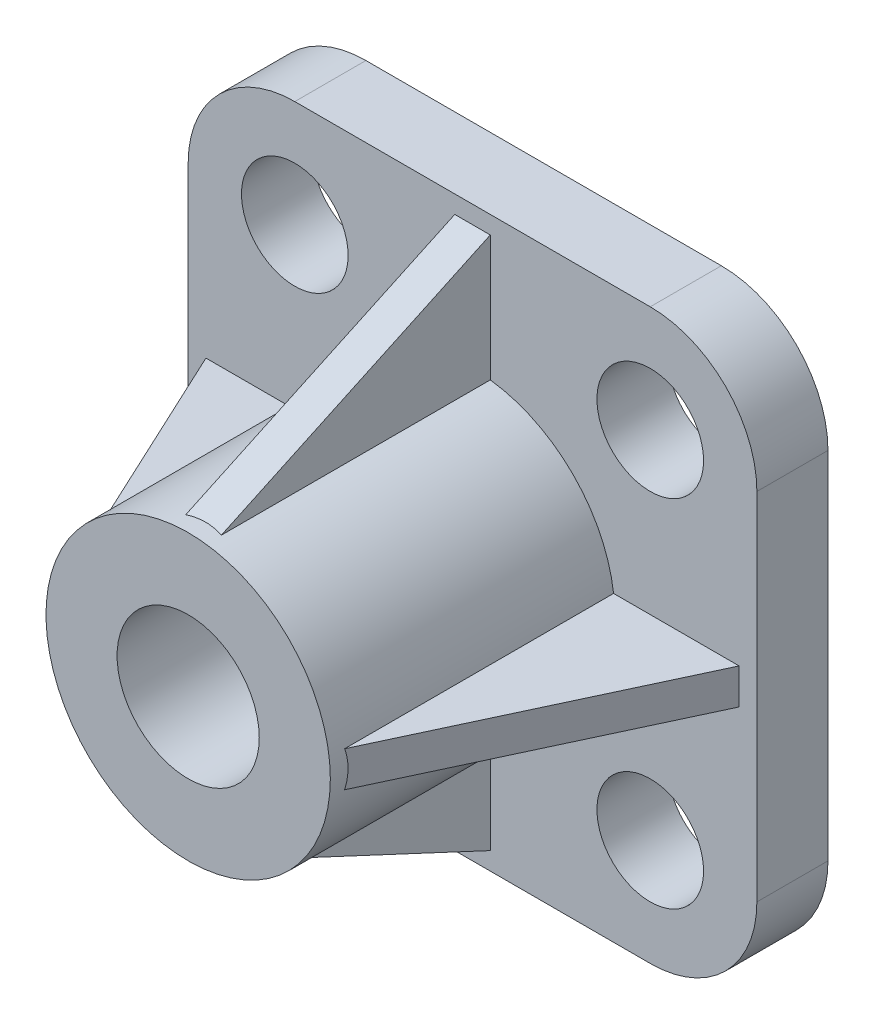
ISO-10303-21;
HEADER;
FILE_DESCRIPTION(('STEP AP214'),'2;1');
FILE_NAME('part.step','',(''),(''),'','','');
FILE_SCHEMA(('AUTOMOTIVE_DESIGN { 1 0 10303 214 1 1 1 1 }'));
ENDSEC;
DATA;
#1=APPLICATION_CONTEXT('core data for automotive mechanical design processes');
#2=APPLICATION_PROTOCOL_DEFINITION('international standard','automotive_design',2000,#1);
#3=PRODUCT_CONTEXT('',#1,'mechanical');
#4=PRODUCT('Part','Part','',(#3));
#5=PRODUCT_RELATED_PRODUCT_CATEGORY('part','',(#4));
#6=PRODUCT_DEFINITION_FORMATION('','',#4);
#7=PRODUCT_DEFINITION_CONTEXT('part definition',#1,'design');
#8=PRODUCT_DEFINITION('design','',#6,#7);
#9=PRODUCT_DEFINITION_SHAPE('','',#8);
#10=(LENGTH_UNIT() NAMED_UNIT(*) SI_UNIT(.MILLI.,.METRE.));
#11=(NAMED_UNIT(*) PLANE_ANGLE_UNIT() SI_UNIT($,.RADIAN.));
#12=(NAMED_UNIT(*) SI_UNIT($,.STERADIAN.) SOLID_ANGLE_UNIT());
#13=UNCERTAINTY_MEASURE_WITH_UNIT(LENGTH_MEASURE(1.E-05),#10,'distance_accuracy_value','');
#14=(GEOMETRIC_REPRESENTATION_CONTEXT(3) GLOBAL_UNCERTAINTY_ASSIGNED_CONTEXT((#13)) GLOBAL_UNIT_ASSIGNED_CONTEXT((#10,
#11,#12)) REPRESENTATION_CONTEXT('',''));
#15=CARTESIAN_POINT('',(0.,0.,0.));
#16=DIRECTION('',(0.,0.,1.));
#17=DIRECTION('',(1.,0.,0.));
#18=AXIS2_PLACEMENT_3D('',#15,#16,#17);
#19=CARTESIAN_POINT('',(0.,80.,-20.));
#20=DIRECTION('',(0.,-1.,0.));
#21=DIRECTION('',(0.,0.,-1.));
#22=AXIS2_PLACEMENT_3D('',#19,#20,#21);
#23=PLANE('',#22);
#24=DIRECTION('',(0.,0.,1.));
#25=VECTOR('',#24,1.);
#26=CARTESIAN_POINT('',(50.,80.,-20.));
#27=LINE('',#26,#25);
#28=CARTESIAN_POINT('',(50.,80.,-20.));
#29=VERTEX_POINT('',#28);
#30=CARTESIAN_POINT('',(50.,80.,0.));
#31=VERTEX_POINT('',#30);
#32=EDGE_CURVE('E343',#29,#31,#27,.T.);
#33=ORIENTED_EDGE('',*,*,#32,.F.);
#34=DIRECTION('',(1.,0.,0.));
#35=VECTOR('',#34,1.);
#36=CARTESIAN_POINT('',(0.,80.,-20.));
#37=LINE('',#36,#35);
#38=CARTESIAN_POINT('',(-50.,80.,-20.));
#39=VERTEX_POINT('',#38);
#40=EDGE_CURVE('E286',#39,#29,#37,.T.);
#41=ORIENTED_EDGE('',*,*,#40,.F.);
#42=DIRECTION('',(0.,0.,1.));
#43=VECTOR('',#42,1.);
#44=CARTESIAN_POINT('',(-50.,80.,-20.));
#45=LINE('',#44,#43);
#46=CARTESIAN_POINT('',(-50.,80.,0.));
#47=VERTEX_POINT('',#46);
#48=EDGE_CURVE('E50',#39,#47,#45,.T.);
#49=ORIENTED_EDGE('',*,*,#48,.T.);
#50=DIRECTION('',(1.,0.,0.));
#51=VECTOR('',#50,1.);
#52=CARTESIAN_POINT('',(0.,80.,0.));
#53=LINE('',#52,#51);
#54=EDGE_CURVE('E322',#47,#31,#53,.T.);
#55=ORIENTED_EDGE('',*,*,#54,.T.);
#56=EDGE_LOOP('',(#33,#41,#49,#55));
#57=FACE_BOUND('',#56,.T.);
#58=ADVANCED_FACE('F43',(#57),#23,.F.);
#59=CARTESIAN_POINT('',(50.,50.,-20.));
#60=DIRECTION('',(0.,0.,1.));
#61=DIRECTION('',(1.,0.,0.));
#62=AXIS2_PLACEMENT_3D('',#59,#60,#61);
#63=CYLINDRICAL_SURFACE('',#62,30.);
#64=CARTESIAN_POINT('',(50.,50.,0.));
#65=DIRECTION('',(0.,0.,1.));
#66=DIRECTION('',(1.,0.,0.));
#67=AXIS2_PLACEMENT_3D('',#64,#65,#66);
#68=CIRCLE('',#67,30.);
#69=CARTESIAN_POINT('',(80.,50.,0.));
#70=VERTEX_POINT('',#69);
#71=EDGE_CURVE('E281',#70,#31,#68,.T.);
#72=ORIENTED_EDGE('',*,*,#71,.F.);
#73=DIRECTION('',(0.,0.,1.));
#74=VECTOR('',#73,1.);
#75=CARTESIAN_POINT('',(80.,50.,-20.));
#76=LINE('',#75,#74);
#77=CARTESIAN_POINT('',(80.,50.,-20.));
#78=VERTEX_POINT('',#77);
#79=EDGE_CURVE('E347',#78,#70,#76,.T.);
#80=ORIENTED_EDGE('',*,*,#79,.F.);
#81=CARTESIAN_POINT('',(50.,50.,-20.));
#82=DIRECTION('',(0.,0.,1.));
#83=DIRECTION('',(1.,0.,0.));
#84=AXIS2_PLACEMENT_3D('',#81,#82,#83);
#85=CIRCLE('',#84,30.);
#86=EDGE_CURVE('E307',#78,#29,#85,.T.);
#87=ORIENTED_EDGE('',*,*,#86,.T.);
#88=ORIENTED_EDGE('',*,*,#32,.T.);
#89=EDGE_LOOP('',(#72,#80,#87,#88));
#90=FACE_BOUND('',#89,.T.);
#91=ADVANCED_FACE('F389',(#90),#63,.T.);
#92=CARTESIAN_POINT('',(80.,0.,-20.));
#93=DIRECTION('',(-1.,0.,0.));
#94=DIRECTION('',(0.,-1.,0.));
#95=AXIS2_PLACEMENT_3D('',#92,#93,#94);
#96=PLANE('',#95);
#97=DIRECTION('',(0.,0.,1.));
#98=VECTOR('',#97,1.);
#99=CARTESIAN_POINT('',(80.,-50.,-20.));
#100=LINE('',#99,#98);
#101=CARTESIAN_POINT('',(80.,-50.,-20.));
#102=VERTEX_POINT('',#101);
#103=CARTESIAN_POINT('',(80.,-50.,0.));
#104=VERTEX_POINT('',#103);
#105=EDGE_CURVE('E346',#102,#104,#100,.T.);
#106=ORIENTED_EDGE('',*,*,#105,.F.);
#107=DIRECTION('',(0.,-1.,0.));
#108=VECTOR('',#107,1.);
#109=CARTESIAN_POINT('',(80.,0.,-20.));
#110=LINE('',#109,#108);
#111=EDGE_CURVE('E301',#78,#102,#110,.T.);
#112=ORIENTED_EDGE('',*,*,#111,.F.);
#113=ORIENTED_EDGE('',*,*,#79,.T.);
#114=DIRECTION('',(0.,-1.,0.));
#115=VECTOR('',#114,1.);
#116=CARTESIAN_POINT('',(80.,0.,0.));
#117=LINE('',#116,#115);
#118=EDGE_CURVE('E338',#70,#104,#117,.T.);
#119=ORIENTED_EDGE('',*,*,#118,.T.);
#120=EDGE_LOOP('',(#106,#112,#113,#119));
#121=FACE_BOUND('',#120,.T.);
#122=ADVANCED_FACE('F393',(#121),#96,.F.);
#123=CARTESIAN_POINT('',(50.,-50.,-20.));
#124=DIRECTION('',(0.,0.,1.));
#125=DIRECTION('',(1.,0.,0.));
#126=AXIS2_PLACEMENT_3D('',#123,#124,#125);
#127=CYLINDRICAL_SURFACE('',#126,30.);
#128=CARTESIAN_POINT('',(50.,-50.,0.));
#129=DIRECTION('',(0.,0.,1.));
#130=DIRECTION('',(1.,0.,0.));
#131=AXIS2_PLACEMENT_3D('',#128,#129,#130);
#132=CIRCLE('',#131,30.);
#133=CARTESIAN_POINT('',(50.,-80.,0.));
#134=VERTEX_POINT('',#133);
#135=EDGE_CURVE('E336',#104,#134,#132,.F.);
#136=ORIENTED_EDGE('',*,*,#135,.T.);
#137=DIRECTION('',(0.,0.,1.));
#138=VECTOR('',#137,1.);
#139=CARTESIAN_POINT('',(50.,-80.,-20.));
#140=LINE('',#139,#138);
#141=CARTESIAN_POINT('',(50.,-80.,-20.));
#142=VERTEX_POINT('',#141);
#143=EDGE_CURVE('E351',#142,#134,#140,.T.);
#144=ORIENTED_EDGE('',*,*,#143,.F.);
#145=CARTESIAN_POINT('',(50.,-50.,-20.));
#146=DIRECTION('',(0.,0.,1.));
#147=DIRECTION('',(1.,0.,0.));
#148=AXIS2_PLACEMENT_3D('',#145,#146,#147);
#149=CIRCLE('',#148,30.);
#150=EDGE_CURVE('E305',#102,#142,#149,.F.);
#151=ORIENTED_EDGE('',*,*,#150,.F.);
#152=ORIENTED_EDGE('',*,*,#105,.T.);
#153=EDGE_LOOP('',(#136,#144,#151,#152));
#154=FACE_BOUND('',#153,.T.);
#155=ADVANCED_FACE('F434',(#154),#127,.T.);
#156=CARTESIAN_POINT('',(0.,-80.,-20.));
#157=DIRECTION('',(0.,-1.,0.));
#158=DIRECTION('',(1.,0.,0.));
#159=AXIS2_PLACEMENT_3D('',#156,#157,#158);
#160=PLANE('',#159);
#161=DIRECTION('',(1.,0.,0.));
#162=VECTOR('',#161,1.);
#163=CARTESIAN_POINT('',(0.,-80.,-20.));
#164=LINE('',#163,#162);
#165=CARTESIAN_POINT('',(-50.,-80.,-20.));
#166=VERTEX_POINT('',#165);
#167=EDGE_CURVE('E300',#166,#142,#164,.T.);
#168=ORIENTED_EDGE('',*,*,#167,.T.);
#169=ORIENTED_EDGE('',*,*,#143,.T.);
#170=DIRECTION('',(1.,0.,0.));
#171=VECTOR('',#170,1.);
#172=CARTESIAN_POINT('',(0.,-80.,0.));
#173=LINE('',#172,#171);
#174=CARTESIAN_POINT('',(-50.,-80.,0.));
#175=VERTEX_POINT('',#174);
#176=EDGE_CURVE('E331',#175,#134,#173,.T.);
#177=ORIENTED_EDGE('',*,*,#176,.F.);
#178=DIRECTION('',(0.,0.,1.));
#179=VECTOR('',#178,1.);
#180=CARTESIAN_POINT('',(-50.,-80.,-20.));
#181=LINE('',#180,#179);
#182=EDGE_CURVE('E353',#166,#175,#181,.T.);
#183=ORIENTED_EDGE('',*,*,#182,.F.);
#184=EDGE_LOOP('',(#168,#169,#177,#183));
#185=FACE_BOUND('',#184,.T.);
#186=ADVANCED_FACE('F438',(#185),#160,.T.);
#187=CARTESIAN_POINT('',(-50.,-50.,-20.));
#188=DIRECTION('',(0.,0.,1.));
#189=DIRECTION('',(1.,0.,0.));
#190=AXIS2_PLACEMENT_3D('',#187,#188,#189);
#191=CYLINDRICAL_SURFACE('',#190,30.);
#192=CARTESIAN_POINT('',(-50.,-50.,0.));
#193=DIRECTION('',(0.,0.,1.));
#194=DIRECTION('',(1.,0.,0.));
#195=AXIS2_PLACEMENT_3D('',#192,#193,#194);
#196=CIRCLE('',#195,30.);
#197=CARTESIAN_POINT('',(-80.,-50.,0.));
#198=VERTEX_POINT('',#197);
#199=EDGE_CURVE('E332',#175,#198,#196,.F.);
#200=ORIENTED_EDGE('',*,*,#199,.T.);
#201=DIRECTION('',(0.,0.,1.));
#202=VECTOR('',#201,1.);
#203=CARTESIAN_POINT('',(-80.,-50.,-20.));
#204=LINE('',#203,#202);
#205=CARTESIAN_POINT('',(-80.,-50.,-20.));
#206=VERTEX_POINT('',#205);
#207=EDGE_CURVE('E357',#206,#198,#204,.T.);
#208=ORIENTED_EDGE('',*,*,#207,.F.);
#209=CARTESIAN_POINT('',(-50.,-50.,-20.));
#210=DIRECTION('',(0.,0.,1.));
#211=DIRECTION('',(1.,0.,0.));
#212=AXIS2_PLACEMENT_3D('',#209,#210,#211);
#213=CIRCLE('',#212,30.);
#214=EDGE_CURVE('E297',#166,#206,#213,.F.);
#215=ORIENTED_EDGE('',*,*,#214,.F.);
#216=ORIENTED_EDGE('',*,*,#182,.T.);
#217=EDGE_LOOP('',(#200,#208,#215,#216));
#218=FACE_BOUND('',#217,.T.);
#219=ADVANCED_FACE('F382',(#218),#191,.T.);
#220=CARTESIAN_POINT('',(-80.,0.,-20.));
#221=DIRECTION('',(-1.,0.,0.));
#222=DIRECTION('',(0.,0.,1.));
#223=AXIS2_PLACEMENT_3D('',#220,#221,#222);
#224=PLANE('',#223);
#225=DIRECTION('',(0.,-1.,0.));
#226=VECTOR('',#225,1.);
#227=CARTESIAN_POINT('',(-80.,0.,-20.));
#228=LINE('',#227,#226);
#229=CARTESIAN_POINT('',(-80.,50.,-20.));
#230=VERTEX_POINT('',#229);
#231=EDGE_CURVE('E293',#230,#206,#228,.T.);
#232=ORIENTED_EDGE('',*,*,#231,.T.);
#233=ORIENTED_EDGE('',*,*,#207,.T.);
#234=DIRECTION('',(0.,-1.,0.));
#235=VECTOR('',#234,1.);
#236=CARTESIAN_POINT('',(-80.,0.,0.));
#237=LINE('',#236,#235);
#238=CARTESIAN_POINT('',(-80.,50.,0.));
#239=VERTEX_POINT('',#238);
#240=EDGE_CURVE('E328',#239,#198,#237,.T.);
#241=ORIENTED_EDGE('',*,*,#240,.F.);
#242=DIRECTION('',(0.,0.,1.));
#243=VECTOR('',#242,1.);
#244=CARTESIAN_POINT('',(-80.,50.,-20.));
#245=LINE('',#244,#243);
#246=EDGE_CURVE('E358',#230,#239,#245,.T.);
#247=ORIENTED_EDGE('',*,*,#246,.F.);
#248=EDGE_LOOP('',(#232,#233,#241,#247));
#249=FACE_BOUND('',#248,.T.);
#250=ADVANCED_FACE('F373',(#249),#224,.T.);
#251=CARTESIAN_POINT('',(-50.,50.,-20.));
#252=DIRECTION('',(0.,0.,1.));
#253=DIRECTION('',(1.,0.,0.));
#254=AXIS2_PLACEMENT_3D('',#251,#252,#253);
#255=CYLINDRICAL_SURFACE('',#254,30.);
#256=CARTESIAN_POINT('',(-50.,50.,0.));
#257=DIRECTION('',(0.,0.,1.));
#258=DIRECTION('',(1.,0.,0.));
#259=AXIS2_PLACEMENT_3D('',#256,#257,#258);
#260=CIRCLE('',#259,30.);
#261=EDGE_CURVE('E326',#47,#239,#260,.T.);
#262=ORIENTED_EDGE('',*,*,#261,.F.);
#263=ORIENTED_EDGE('',*,*,#48,.F.);
#264=CARTESIAN_POINT('',(-50.,50.,-20.));
#265=DIRECTION('',(0.,0.,1.));
#266=DIRECTION('',(1.,0.,0.));
#267=AXIS2_PLACEMENT_3D('',#264,#265,#266);
#268=CIRCLE('',#267,30.);
#269=EDGE_CURVE('E295',#39,#230,#268,.T.);
#270=ORIENTED_EDGE('',*,*,#269,.T.);
#271=ORIENTED_EDGE('',*,*,#246,.T.);
#272=EDGE_LOOP('',(#262,#263,#270,#271));
#273=FACE_BOUND('',#272,.T.);
#274=ADVANCED_FACE('F367',(#273),#255,.T.);
#275=CARTESIAN_POINT('',(50.,-50.,-20.));
#276=DIRECTION('',(0.,0.,1.));
#277=DIRECTION('',(1.,0.,0.));
#278=AXIS2_PLACEMENT_3D('',#275,#276,#277);
#279=CYLINDRICAL_SURFACE('',#278,15.);
#280=CARTESIAN_POINT('',(50.,-50.,-20.));
#281=DIRECTION('',(0.,0.,1.));
#282=DIRECTION('',(1.,0.,0.));
#283=AXIS2_PLACEMENT_3D('',#280,#281,#282);
#284=CIRCLE('',#283,15.);
#285=CARTESIAN_POINT('',(65.,-50.,-20.));
#286=VERTEX_POINT('',#285);
#287=EDGE_CURVE('E290',#286,#286,#284,.T.);
#288=ORIENTED_EDGE('',*,*,#287,.F.);
#289=EDGE_LOOP('',(#288));
#290=FACE_BOUND('',#289,.T.);
#291=CARTESIAN_POINT('',(50.,-50.,0.));
#292=DIRECTION('',(0.,0.,1.));
#293=DIRECTION('',(1.,0.,0.));
#294=AXIS2_PLACEMENT_3D('',#291,#292,#293);
#295=CIRCLE('',#294,15.);
#296=CARTESIAN_POINT('',(65.,-50.,0.));
#297=VERTEX_POINT('',#296);
#298=EDGE_CURVE('E321',#297,#297,#295,.T.);
#299=ORIENTED_EDGE('',*,*,#298,.T.);
#300=EDGE_LOOP('',(#299));
#301=FACE_BOUND('',#300,.T.);
#302=ADVANCED_FACE('F375',(#290,#301),#279,.F.);
#303=CARTESIAN_POINT('',(-50.0000000000001,-50.,-20.));
#304=DIRECTION('',(0.,0.,1.));
#305=DIRECTION('',(1.,0.,0.));
#306=AXIS2_PLACEMENT_3D('',#303,#304,#305);
#307=CYLINDRICAL_SURFACE('',#306,15.);
#308=CARTESIAN_POINT('',(-50.0000000000001,-50.,-20.));
#309=DIRECTION('',(0.,0.,1.));
#310=DIRECTION('',(1.,0.,0.));
#311=AXIS2_PLACEMENT_3D('',#308,#309,#310);
#312=CIRCLE('',#311,15.);
#313=CARTESIAN_POINT('',(-35.0000000000001,-50.,-20.));
#314=VERTEX_POINT('',#313);
#315=EDGE_CURVE('E283',#314,#314,#312,.T.);
#316=ORIENTED_EDGE('',*,*,#315,.F.);
#317=EDGE_LOOP('',(#316));
#318=FACE_BOUND('',#317,.T.);
#319=CARTESIAN_POINT('',(-50.0000000000001,-50.,0.));
#320=DIRECTION('',(0.,0.,1.));
#321=DIRECTION('',(1.,0.,0.));
#322=AXIS2_PLACEMENT_3D('',#319,#320,#321);
#323=CIRCLE('',#322,15.);
#324=CARTESIAN_POINT('',(-35.0000000000001,-50.,0.));
#325=VERTEX_POINT('',#324);
#326=EDGE_CURVE('E318',#325,#325,#323,.T.);
#327=ORIENTED_EDGE('',*,*,#326,.T.);
#328=EDGE_LOOP('',(#327));
#329=FACE_BOUND('',#328,.T.);
#330=ADVANCED_FACE('F377',(#318,#329),#307,.F.);
#331=CARTESIAN_POINT('',(-50.,50.0000000000001,-20.));
#332=DIRECTION('',(0.,0.,1.));
#333=DIRECTION('',(1.,0.,0.));
#334=AXIS2_PLACEMENT_3D('',#331,#332,#333);
#335=CYLINDRICAL_SURFACE('',#334,15.);
#336=CARTESIAN_POINT('',(-50.,50.0000000000001,-20.));
#337=DIRECTION('',(0.,0.,1.));
#338=DIRECTION('',(1.,0.,0.));
#339=AXIS2_PLACEMENT_3D('',#336,#337,#338);
#340=CIRCLE('',#339,15.);
#341=CARTESIAN_POINT('',(-35.,50.0000000000001,-20.));
#342=VERTEX_POINT('',#341);
#343=EDGE_CURVE('E278',#342,#342,#340,.T.);
#344=ORIENTED_EDGE('',*,*,#343,.F.);
#345=EDGE_LOOP('',(#344));
#346=FACE_BOUND('',#345,.T.);
#347=CARTESIAN_POINT('',(-50.,50.0000000000001,0.));
#348=DIRECTION('',(0.,0.,1.));
#349=DIRECTION('',(1.,0.,0.));
#350=AXIS2_PLACEMENT_3D('',#347,#348,#349);
#351=CIRCLE('',#350,15.);
#352=CARTESIAN_POINT('',(-35.,50.0000000000001,0.));
#353=VERTEX_POINT('',#352);
#354=EDGE_CURVE('E312',#353,#353,#351,.T.);
#355=ORIENTED_EDGE('',*,*,#354,.T.);
#356=EDGE_LOOP('',(#355));
#357=FACE_BOUND('',#356,.T.);
#358=ADVANCED_FACE('F399',(#346,#357),#335,.F.);
#359=CARTESIAN_POINT('',(50.0000000000001,50.0000000000001,-20.));
#360=DIRECTION('',(0.,0.,1.));
#361=DIRECTION('',(1.,0.,0.));
#362=AXIS2_PLACEMENT_3D('',#359,#360,#361);
#363=CYLINDRICAL_SURFACE('',#362,15.);
#364=CARTESIAN_POINT('',(50.0000000000001,50.0000000000001,-20.));
#365=DIRECTION('',(0.,0.,1.));
#366=DIRECTION('',(1.,0.,0.));
#367=AXIS2_PLACEMENT_3D('',#364,#365,#366);
#368=CIRCLE('',#367,15.);
#369=CARTESIAN_POINT('',(65.0000000000001,50.0000000000001,-20.));
#370=VERTEX_POINT('',#369);
#371=EDGE_CURVE('E280',#370,#370,#368,.T.);
#372=ORIENTED_EDGE('',*,*,#371,.F.);
#373=EDGE_LOOP('',(#372));
#374=FACE_BOUND('',#373,.T.);
#375=CARTESIAN_POINT('',(50.0000000000001,50.0000000000001,0.));
#376=DIRECTION('',(0.,0.,1.));
#377=DIRECTION('',(1.,0.,0.));
#378=AXIS2_PLACEMENT_3D('',#375,#376,#377);
#379=CIRCLE('',#378,15.);
#380=CARTESIAN_POINT('',(65.0000000000001,50.0000000000001,0.));
#381=VERTEX_POINT('',#380);
#382=EDGE_CURVE('E274',#381,#381,#379,.T.);
#383=ORIENTED_EDGE('',*,*,#382,.T.);
#384=EDGE_LOOP('',(#383));
#385=FACE_BOUND('',#384,.T.);
#386=ADVANCED_FACE('F44',(#374,#385),#363,.F.);
#387=CARTESIAN_POINT('',(0.,0.,-20.));
#388=DIRECTION('',(0.,0.,1.));
#389=DIRECTION('',(1.,0.,0.));
#390=AXIS2_PLACEMENT_3D('',#387,#388,#389);
#391=CYLINDRICAL_SURFACE('',#390,20.);
#392=CARTESIAN_POINT('',(0.,0.,-20.));
#393=DIRECTION('',(0.,0.,1.));
#394=DIRECTION('',(1.,0.,0.));
#395=AXIS2_PLACEMENT_3D('',#392,#393,#394);
#396=CIRCLE('',#395,20.);
#397=CARTESIAN_POINT('',(20.,0.,-20.));
#398=VERTEX_POINT('',#397);
#399=EDGE_CURVE('E309',#398,#398,#396,.T.);
#400=ORIENTED_EDGE('',*,*,#399,.F.);
#401=EDGE_LOOP('',(#400));
#402=FACE_BOUND('',#401,.T.);
#403=CARTESIAN_POINT('',(0.,0.,80.));
#404=DIRECTION('',(0.,0.,1.));
#405=DIRECTION('',(1.,0.,0.));
#406=AXIS2_PLACEMENT_3D('',#403,#404,#405);
#407=CIRCLE('',#406,20.);
#408=CARTESIAN_POINT('',(20.,0.,80.));
#409=VERTEX_POINT('',#408);
#410=EDGE_CURVE('E269',#409,#409,#407,.T.);
#411=ORIENTED_EDGE('',*,*,#410,.T.);
#412=EDGE_LOOP('',(#411));
#413=FACE_BOUND('',#412,.T.);
#414=ADVANCED_FACE('F406',(#402,#413),#391,.F.);
#415=CARTESIAN_POINT('',(0.,0.,-20.));
#416=DIRECTION('',(0.,0.,1.));
#417=DIRECTION('',(1.,0.,0.));
#418=AXIS2_PLACEMENT_3D('',#415,#416,#417);
#419=PLANE('',#418);
#420=ORIENTED_EDGE('',*,*,#399,.T.);
#421=EDGE_LOOP('',(#420));
#422=FACE_BOUND('',#421,.T.);
#423=ORIENTED_EDGE('',*,*,#150,.T.);
#424=ORIENTED_EDGE('',*,*,#167,.F.);
#425=ORIENTED_EDGE('',*,*,#214,.T.);
#426=ORIENTED_EDGE('',*,*,#231,.F.);
#427=ORIENTED_EDGE('',*,*,#269,.F.);
#428=ORIENTED_EDGE('',*,*,#40,.T.);
#429=ORIENTED_EDGE('',*,*,#86,.F.);
#430=ORIENTED_EDGE('',*,*,#111,.T.);
#431=EDGE_LOOP('',(#423,#424,#425,#426,#427,#428,#429,#430));
#432=FACE_BOUND('',#431,.T.);
#433=ORIENTED_EDGE('',*,*,#287,.T.);
#434=EDGE_LOOP('',(#433));
#435=FACE_BOUND('',#434,.T.);
#436=ORIENTED_EDGE('',*,*,#371,.T.);
#437=EDGE_LOOP('',(#436));
#438=FACE_BOUND('',#437,.T.);
#439=ORIENTED_EDGE('',*,*,#343,.T.);
#440=EDGE_LOOP('',(#439));
#441=FACE_BOUND('',#440,.T.);
#442=ORIENTED_EDGE('',*,*,#315,.T.);
#443=EDGE_LOOP('',(#442));
#444=FACE_BOUND('',#443,.T.);
#445=ADVANCED_FACE('F414',(#422,#432,#435,#438,#441,#444),#419,.F.);
#446=CARTESIAN_POINT('',(0.,0.,0.));
#447=DIRECTION('',(0.,0.,1.));
#448=DIRECTION('',(1.,0.,0.));
#449=AXIS2_PLACEMENT_3D('',#446,#447,#448);
#450=PLANE('',#449);
#451=ORIENTED_EDGE('',*,*,#71,.T.);
#452=ORIENTED_EDGE('',*,*,#54,.F.);
#453=ORIENTED_EDGE('',*,*,#261,.T.);
#454=ORIENTED_EDGE('',*,*,#240,.T.);
#455=ORIENTED_EDGE('',*,*,#199,.F.);
#456=ORIENTED_EDGE('',*,*,#176,.T.);
#457=ORIENTED_EDGE('',*,*,#135,.F.);
#458=ORIENTED_EDGE('',*,*,#118,.F.);
#459=EDGE_LOOP('',(#451,#452,#453,#454,#455,#456,#457,#458));
#460=FACE_BOUND('',#459,.T.);
#461=DIRECTION('',(-1.,0.,0.));
#462=VECTOR('',#461,1.);
#463=CARTESIAN_POINT('',(-2.61861100413235E-13,75.,0.));
#464=LINE('',#463,#462);
#465=CARTESIAN_POINT('',(4.99999999999974,75.,0.));
#466=VERTEX_POINT('',#465);
#467=CARTESIAN_POINT('',(-5.00000000000034,75.,0.));
#468=VERTEX_POINT('',#467);
#469=EDGE_CURVE('E245',#466,#468,#464,.T.);
#470=ORIENTED_EDGE('',*,*,#469,.F.);
#471=DIRECTION('',(0.,-1.,0.));
#472=VECTOR('',#471,1.);
#473=CARTESIAN_POINT('',(5.,0.,0.));
#474=LINE('',#473,#472);
#475=CARTESIAN_POINT('',(4.99999999999986,39.6862696659689,0.));
#476=VERTEX_POINT('',#475);
#477=EDGE_CURVE('E233',#466,#476,#474,.T.);
#478=ORIENTED_EDGE('',*,*,#477,.T.);
#479=CARTESIAN_POINT('',(0.,0.,0.));
#480=DIRECTION('',(0.,0.,1.));
#481=DIRECTION('',(1.,0.,0.));
#482=AXIS2_PLACEMENT_3D('',#479,#480,#481);
#483=CIRCLE('',#482,40.);
#484=CARTESIAN_POINT('',(39.6862696659689,5.,0.));
#485=VERTEX_POINT('',#484);
#486=EDGE_CURVE('E11',#485,#476,#483,.T.);
#487=ORIENTED_EDGE('',*,*,#486,.F.);
#488=DIRECTION('',(-1.,0.,0.));
#489=VECTOR('',#488,1.);
#490=CARTESIAN_POINT('',(0.,5.,0.));
#491=LINE('',#490,#489);
#492=CARTESIAN_POINT('',(75.,5.,0.));
#493=VERTEX_POINT('',#492);
#494=EDGE_CURVE('E261',#493,#485,#491,.T.);
#495=ORIENTED_EDGE('',*,*,#494,.F.);
#496=DIRECTION('',(0.,1.,0.));
#497=VECTOR('',#496,1.);
#498=CARTESIAN_POINT('',(75.,0.,0.));
#499=LINE('',#498,#497);
#500=CARTESIAN_POINT('',(75.,-5.,0.));
#501=VERTEX_POINT('',#500);
#502=EDGE_CURVE('E270',#501,#493,#499,.T.);
#503=ORIENTED_EDGE('',*,*,#502,.F.);
#504=DIRECTION('',(-1.,0.,0.));
#505=VECTOR('',#504,1.);
#506=CARTESIAN_POINT('',(0.,-5.,0.));
#507=LINE('',#506,#505);
#508=CARTESIAN_POINT('',(39.6862696659689,-5.,0.));
#509=VERTEX_POINT('',#508);
#510=EDGE_CURVE('E254',#501,#509,#507,.T.);
#511=ORIENTED_EDGE('',*,*,#510,.T.);
#512=CARTESIAN_POINT('',(5.00000000000042,-39.6862696659688,0.));
#513=VERTEX_POINT('',#512);
#514=EDGE_CURVE('E53',#513,#509,#483,.T.);
#515=ORIENTED_EDGE('',*,*,#514,.F.);
#516=DIRECTION('',(0.,1.,0.));
#517=VECTOR('',#516,1.);
#518=CARTESIAN_POINT('',(5.,0.,0.));
#519=LINE('',#518,#517);
#520=CARTESIAN_POINT('',(5.00000000000102,-75.,0.));
#521=VERTEX_POINT('',#520);
#522=EDGE_CURVE('E61',#521,#513,#519,.T.);
#523=ORIENTED_EDGE('',*,*,#522,.F.);
#524=DIRECTION('',(1.,0.,0.));
#525=VECTOR('',#524,1.);
#526=CARTESIAN_POINT('',(7.85583301239705E-13,-75.,0.));
#527=LINE('',#526,#525);
#528=CARTESIAN_POINT('',(-4.99999999999921,-75.0000000000001,0.));
#529=VERTEX_POINT('',#528);
#530=EDGE_CURVE('E65',#529,#521,#527,.T.);
#531=ORIENTED_EDGE('',*,*,#530,.F.);
#532=DIRECTION('',(0.,1.,0.));
#533=VECTOR('',#532,1.);
#534=CARTESIAN_POINT('',(-5.,0.,0.));
#535=LINE('',#534,#533);
#536=CARTESIAN_POINT('',(-4.99999999999958,-39.6862696659689,0.));
#537=VERTEX_POINT('',#536);
#538=EDGE_CURVE('E188',#529,#537,#535,.T.);
#539=ORIENTED_EDGE('',*,*,#538,.T.);
#540=CARTESIAN_POINT('',(-39.6862696659689,-5.,0.));
#541=VERTEX_POINT('',#540);
#542=EDGE_CURVE('E182',#541,#537,#483,.T.);
#543=ORIENTED_EDGE('',*,*,#542,.F.);
#544=DIRECTION('',(1.,0.,0.));
#545=VECTOR('',#544,1.);
#546=CARTESIAN_POINT('',(0.,-5.,0.));
#547=LINE('',#546,#545);
#548=CARTESIAN_POINT('',(-75.,-5.,0.));
#549=VERTEX_POINT('',#548);
#550=EDGE_CURVE('E215',#549,#541,#547,.T.);
#551=ORIENTED_EDGE('',*,*,#550,.F.);
#552=DIRECTION('',(0.,-1.,0.));
#553=VECTOR('',#552,1.);
#554=CARTESIAN_POINT('',(-75.,0.,0.));
#555=LINE('',#554,#553);
#556=CARTESIAN_POINT('',(-75.,5.,0.));
#557=VERTEX_POINT('',#556);
#558=EDGE_CURVE('E224',#557,#549,#555,.T.);
#559=ORIENTED_EDGE('',*,*,#558,.F.);
#560=DIRECTION('',(1.,0.,0.));
#561=VECTOR('',#560,1.);
#562=CARTESIAN_POINT('',(0.,5.,0.));
#563=LINE('',#562,#561);
#564=CARTESIAN_POINT('',(-39.6862696659689,5.,0.));
#565=VERTEX_POINT('',#564);
#566=EDGE_CURVE('E216',#557,#565,#563,.T.);
#567=ORIENTED_EDGE('',*,*,#566,.T.);
#568=CARTESIAN_POINT('',(-5.00000000000014,39.6862696659688,0.));
#569=VERTEX_POINT('',#568);
#570=EDGE_CURVE('E55',#569,#565,#483,.T.);
#571=ORIENTED_EDGE('',*,*,#570,.F.);
#572=DIRECTION('',(0.,-1.,0.));
#573=VECTOR('',#572,1.);
#574=CARTESIAN_POINT('',(-5.,0.,0.));
#575=LINE('',#574,#573);
#576=EDGE_CURVE('E239',#468,#569,#575,.T.);
#577=ORIENTED_EDGE('',*,*,#576,.F.);
#578=EDGE_LOOP('',(#470,#478,#487,#495,#503,#511,#515,#523,#531,#539,#543,#551,#559,#567,#571,#577));
#579=FACE_BOUND('',#578,.T.);
#580=ORIENTED_EDGE('',*,*,#382,.F.);
#581=EDGE_LOOP('',(#580));
#582=FACE_BOUND('',#581,.T.);
#583=ORIENTED_EDGE('',*,*,#354,.F.);
#584=EDGE_LOOP('',(#583));
#585=FACE_BOUND('',#584,.T.);
#586=ORIENTED_EDGE('',*,*,#326,.F.);
#587=EDGE_LOOP('',(#586));
#588=FACE_BOUND('',#587,.T.);
#589=ORIENTED_EDGE('',*,*,#298,.F.);
#590=EDGE_LOOP('',(#589));
#591=FACE_BOUND('',#590,.T.);
#592=ADVANCED_FACE('F190',(#460,#579,#582,#585,#588,#591),#450,.T.);
#593=CARTESIAN_POINT('',(0.,0.,80.));
#594=DIRECTION('',(0.,0.,-1.));
#595=DIRECTION('',(-1.,0.,0.));
#596=AXIS2_PLACEMENT_3D('',#593,#594,#595);
#597=CYLINDRICAL_SURFACE('',#596,40.);
#598=CARTESIAN_POINT('',(0.,0.,80.));
#599=DIRECTION('',(0.,0.,1.));
#600=DIRECTION('',(1.,0.,0.));
#601=AXIS2_PLACEMENT_3D('',#598,#599,#600);
#602=CIRCLE('',#601,40.);
#603=CARTESIAN_POINT('',(40.,0.,80.));
#604=VERTEX_POINT('',#603);
#605=EDGE_CURVE('E272',#604,#604,#602,.T.);
#606=ORIENTED_EDGE('',*,*,#605,.F.);
#607=EDGE_LOOP('',(#606));
#608=FACE_BOUND('',#607,.T.);
#609=DIRECTION('',(0.,0.,-1.));
#610=VECTOR('',#609,1.);
#611=CARTESIAN_POINT('',(4.99999999999986,39.6862696659689,80.));
#612=LINE('',#611,#610);
#613=CARTESIAN_POINT('',(4.99999999999986,39.6862696659689,75.6722792872096));
#614=VERTEX_POINT('',#613);
#615=EDGE_CURVE('E230',#614,#476,#612,.T.);
#616=ORIENTED_EDGE('',*,*,#615,.F.);
#617=CARTESIAN_POINT('',(0.,0.,160.714285714286));
#618=DIRECTION('',(0.,0.906183139995265,0.422885465331124));
#619=DIRECTION('',(0.,0.422885465331124,-0.906183139995265));
#620=AXIS2_PLACEMENT_3D('',#617,#618,#619);
#621=ELLIPSE('',#620,94.5882591842677,40.);
#622=CARTESIAN_POINT('',(-5.00000000000014,39.6862696659689,75.6722792872095));
#623=VERTEX_POINT('',#622);
#624=EDGE_CURVE('E242',#614,#623,#621,.T.);
#625=ORIENTED_EDGE('',*,*,#624,.T.);
#626=DIRECTION('',(0.,0.,-1.));
#627=VECTOR('',#626,1.);
#628=CARTESIAN_POINT('',(-5.00000000000014,39.6862696659688,80.));
#629=LINE('',#628,#627);
#630=EDGE_CURVE('E237',#623,#569,#629,.T.);
#631=ORIENTED_EDGE('',*,*,#630,.T.);
#632=ORIENTED_EDGE('',*,*,#570,.T.);
#633=DIRECTION('',(0.,0.,-1.));
#634=VECTOR('',#633,1.);
#635=CARTESIAN_POINT('',(-39.6862696659689,5.,80.));
#636=LINE('',#635,#634);
#637=CARTESIAN_POINT('',(-39.6862696659689,5.,75.6722792872096));
#638=VERTEX_POINT('',#637);
#639=EDGE_CURVE('E212',#638,#565,#636,.T.);
#640=ORIENTED_EDGE('',*,*,#639,.F.);
#641=CARTESIAN_POINT('',(0.,0.,160.714285714286));
#642=DIRECTION('',(-0.906183139995265,0.,0.422885465331124));
#643=DIRECTION('',(-0.422885465331124,0.,-0.906183139995265));
#644=AXIS2_PLACEMENT_3D('',#641,#642,#643);
#645=ELLIPSE('',#644,94.5882591842677,40.);
#646=CARTESIAN_POINT('',(-39.6862696659689,-5.,75.6722792872096));
#647=VERTEX_POINT('',#646);
#648=EDGE_CURVE('E218',#638,#647,#645,.T.);
#649=ORIENTED_EDGE('',*,*,#648,.T.);
#650=DIRECTION('',(0.,0.,-1.));
#651=VECTOR('',#650,1.);
#652=CARTESIAN_POINT('',(-39.6862696659689,-5.,80.));
#653=LINE('',#652,#651);
#654=EDGE_CURVE('E187',#647,#541,#653,.T.);
#655=ORIENTED_EDGE('',*,*,#654,.T.);
#656=ORIENTED_EDGE('',*,*,#542,.T.);
#657=DIRECTION('',(0.,0.,-1.));
#658=VECTOR('',#657,1.);
#659=CARTESIAN_POINT('',(-4.99999999999958,-39.6862696659689,80.));
#660=LINE('',#659,#658);
#661=CARTESIAN_POINT('',(-4.99999999999958,-39.6862696659689,75.6722792872096));
#662=VERTEX_POINT('',#661);
#663=EDGE_CURVE('E184',#662,#537,#660,.T.);
#664=ORIENTED_EDGE('',*,*,#663,.F.);
#665=CARTESIAN_POINT('',(0.,0.,160.714285714286));
#666=DIRECTION('',(0.,-0.906183139995265,0.422885465331124));
#667=DIRECTION('',(0.,-0.422885465331124,-0.906183139995265));
#668=AXIS2_PLACEMENT_3D('',#665,#666,#667);
#669=ELLIPSE('',#668,94.5882591842677,40.);
#670=CARTESIAN_POINT('',(5.00000000000042,-39.6862696659688,75.6722792872095));
#671=VERTEX_POINT('',#670);
#672=EDGE_CURVE('E191',#662,#671,#669,.T.);
#673=ORIENTED_EDGE('',*,*,#672,.T.);
#674=DIRECTION('',(0.,0.,-1.));
#675=VECTOR('',#674,1.);
#676=CARTESIAN_POINT('',(5.00000000000042,-39.6862696659688,80.));
#677=LINE('',#676,#675);
#678=EDGE_CURVE('E199',#671,#513,#677,.T.);
#679=ORIENTED_EDGE('',*,*,#678,.T.);
#680=ORIENTED_EDGE('',*,*,#514,.T.);
#681=DIRECTION('',(0.,0.,-1.));
#682=VECTOR('',#681,1.);
#683=CARTESIAN_POINT('',(39.6862696659689,-5.,80.));
#684=LINE('',#683,#682);
#685=CARTESIAN_POINT('',(39.6862696659689,-5.,75.6722792872096));
#686=VERTEX_POINT('',#685);
#687=EDGE_CURVE('E252',#686,#509,#684,.T.);
#688=ORIENTED_EDGE('',*,*,#687,.F.);
#689=CARTESIAN_POINT('',(0.,0.,160.714285714286));
#690=DIRECTION('',(0.906183139995265,0.,0.422885465331124));
#691=DIRECTION('',(0.422885465331124,0.,-0.906183139995265));
#692=AXIS2_PLACEMENT_3D('',#689,#690,#691);
#693=ELLIPSE('',#692,94.5882591842677,40.);
#694=CARTESIAN_POINT('',(39.6862696659689,5.,75.6722792872096));
#695=VERTEX_POINT('',#694);
#696=EDGE_CURVE('E262',#686,#695,#693,.T.);
#697=ORIENTED_EDGE('',*,*,#696,.T.);
#698=DIRECTION('',(0.,0.,-1.));
#699=VECTOR('',#698,1.);
#700=CARTESIAN_POINT('',(39.6862696659689,5.,80.));
#701=LINE('',#700,#699);
#702=EDGE_CURVE('E256',#695,#485,#701,.T.);
#703=ORIENTED_EDGE('',*,*,#702,.T.);
#704=ORIENTED_EDGE('',*,*,#486,.T.);
#705=EDGE_LOOP('',(#616,#625,#631,#632,#640,#649,#655,#656,#664,#673,#679,#680,#688,#697,#703,#704));
#706=FACE_BOUND('',#705,.T.);
#707=ADVANCED_FACE('F185',(#608,#706),#597,.T.);
#708=CARTESIAN_POINT('',(0.,0.,80.));
#709=DIRECTION('',(0.,0.,1.));
#710=DIRECTION('',(1.,0.,0.));
#711=AXIS2_PLACEMENT_3D('',#708,#709,#710);
#712=PLANE('',#711);
#713=ORIENTED_EDGE('',*,*,#410,.F.);
#714=EDGE_LOOP('',(#713));
#715=FACE_BOUND('',#714,.T.);
#716=ORIENTED_EDGE('',*,*,#605,.T.);
#717=EDGE_LOOP('',(#716));
#718=FACE_BOUND('',#717,.T.);
#719=ADVANCED_FACE('F422',(#715,#718),#712,.T.);
#720=CARTESIAN_POINT('',(40.,0.,75.));
#721=DIRECTION('',(0.906183139995265,0.,0.422885465331124));
#722=DIRECTION('',(0.422885465331124,0.,-0.906183139995265));
#723=AXIS2_PLACEMENT_3D('',#720,#721,#722);
#724=PLANE('',#723);
#725=DIRECTION('',(0.422885465331124,0.,-0.906183139995265));
#726=VECTOR('',#725,1.);
#727=CARTESIAN_POINT('',(40.,-5.,75.));
#728=LINE('',#727,#726);
#729=EDGE_CURVE('E248',#686,#501,#728,.T.);
#730=ORIENTED_EDGE('',*,*,#729,.T.);
#731=ORIENTED_EDGE('',*,*,#502,.T.);
#732=DIRECTION('',(0.422885465331124,0.,-0.906183139995265));
#733=VECTOR('',#732,1.);
#734=CARTESIAN_POINT('',(40.,5.,75.));
#735=LINE('',#734,#733);
#736=EDGE_CURVE('E249',#695,#493,#735,.T.);
#737=ORIENTED_EDGE('',*,*,#736,.F.);
#738=ORIENTED_EDGE('',*,*,#696,.F.);
#739=EDGE_LOOP('',(#730,#731,#737,#738));
#740=FACE_BOUND('',#739,.T.);
#741=ADVANCED_FACE('F534',(#740),#724,.T.);
#742=CARTESIAN_POINT('',(0.,5.,30.));
#743=DIRECTION('',(0.,1.,0.));
#744=DIRECTION('',(0.,0.,1.));
#745=AXIS2_PLACEMENT_3D('',#742,#743,#744);
#746=PLANE('',#745);
#747=ORIENTED_EDGE('',*,*,#736,.T.);
#748=ORIENTED_EDGE('',*,*,#494,.T.);
#749=ORIENTED_EDGE('',*,*,#702,.F.);
#750=EDGE_LOOP('',(#747,#748,#749));
#751=FACE_BOUND('',#750,.T.);
#752=ADVANCED_FACE('F543',(#751),#746,.T.);
#753=CARTESIAN_POINT('',(0.,-5.,30.));
#754=DIRECTION('',(0.,1.,0.));
#755=DIRECTION('',(0.,0.,1.));
#756=AXIS2_PLACEMENT_3D('',#753,#754,#755);
#757=PLANE('',#756);
#758=ORIENTED_EDGE('',*,*,#510,.F.);
#759=ORIENTED_EDGE('',*,*,#729,.F.);
#760=ORIENTED_EDGE('',*,*,#687,.T.);
#761=EDGE_LOOP('',(#758,#759,#760));
#762=FACE_BOUND('',#761,.T.);
#763=ADVANCED_FACE('F555',(#762),#757,.F.);
#764=CARTESIAN_POINT('',(-1.39659253553725E-13,40.,75.));
#765=DIRECTION('',(0.,0.906183139995265,0.422885465331124));
#766=DIRECTION('',(0.,0.422885465331124,-0.906183139995265));
#767=AXIS2_PLACEMENT_3D('',#764,#765,#766);
#768=PLANE('',#767);
#769=DIRECTION('',(0.,0.422885465331124,-0.906183139995265));
#770=VECTOR('',#769,1.);
#771=CARTESIAN_POINT('',(4.99999999999986,40.,75.));
#772=LINE('',#771,#770);
#773=EDGE_CURVE('E226',#614,#466,#772,.T.);
#774=ORIENTED_EDGE('',*,*,#773,.T.);
#775=ORIENTED_EDGE('',*,*,#469,.T.);
#776=DIRECTION('',(0.,0.422885465331124,-0.906183139995265));
#777=VECTOR('',#776,1.);
#778=CARTESIAN_POINT('',(-5.00000000000014,40.,75.));
#779=LINE('',#778,#777);
#780=EDGE_CURVE('E227',#623,#468,#779,.T.);
#781=ORIENTED_EDGE('',*,*,#780,.F.);
#782=ORIENTED_EDGE('',*,*,#624,.F.);
#783=EDGE_LOOP('',(#774,#775,#781,#782));
#784=FACE_BOUND('',#783,.T.);
#785=ADVANCED_FACE('F560',(#784),#768,.T.);
#786=CARTESIAN_POINT('',(-5.,0.,30.));
#787=DIRECTION('',(-1.,0.,0.));
#788=DIRECTION('',(0.,-1.,0.));
#789=AXIS2_PLACEMENT_3D('',#786,#787,#788);
#790=PLANE('',#789);
#791=ORIENTED_EDGE('',*,*,#780,.T.);
#792=ORIENTED_EDGE('',*,*,#576,.T.);
#793=ORIENTED_EDGE('',*,*,#630,.F.);
#794=EDGE_LOOP('',(#791,#792,#793));
#795=FACE_BOUND('',#794,.T.);
#796=ADVANCED_FACE('F569',(#795),#790,.T.);
#797=CARTESIAN_POINT('',(5.,0.,30.));
#798=DIRECTION('',(-1.,0.,0.));
#799=DIRECTION('',(0.,-1.,0.));
#800=AXIS2_PLACEMENT_3D('',#797,#798,#799);
#801=PLANE('',#800);
#802=ORIENTED_EDGE('',*,*,#477,.F.);
#803=ORIENTED_EDGE('',*,*,#773,.F.);
#804=ORIENTED_EDGE('',*,*,#615,.T.);
#805=EDGE_LOOP('',(#802,#803,#804));
#806=FACE_BOUND('',#805,.T.);
#807=ADVANCED_FACE('F578',(#806),#801,.F.);
#808=CARTESIAN_POINT('',(-40.,0.,75.));
#809=DIRECTION('',(-0.906183139995265,0.,0.422885465331124));
#810=DIRECTION('',(-0.422885465331124,0.,-0.906183139995265));
#811=AXIS2_PLACEMENT_3D('',#808,#809,#810);
#812=PLANE('',#811);
#813=DIRECTION('',(-0.422885465331124,0.,-0.906183139995265));
#814=VECTOR('',#813,1.);
#815=CARTESIAN_POINT('',(-40.,5.,75.));
#816=LINE('',#815,#814);
#817=EDGE_CURVE('E206',#638,#557,#816,.T.);
#818=ORIENTED_EDGE('',*,*,#817,.T.);
#819=ORIENTED_EDGE('',*,*,#558,.T.);
#820=DIRECTION('',(-0.422885465331124,0.,-0.906183139995265));
#821=VECTOR('',#820,1.);
#822=CARTESIAN_POINT('',(-40.,-5.,75.));
#823=LINE('',#822,#821);
#824=EDGE_CURVE('E210',#647,#549,#823,.T.);
#825=ORIENTED_EDGE('',*,*,#824,.F.);
#826=ORIENTED_EDGE('',*,*,#648,.F.);
#827=EDGE_LOOP('',(#818,#819,#825,#826));
#828=FACE_BOUND('',#827,.T.);
#829=ADVANCED_FACE('F590',(#828),#812,.T.);
#830=CARTESIAN_POINT('',(0.,5.,30.));
#831=DIRECTION('',(0.,-1.,0.));
#832=DIRECTION('',(0.,0.,-1.));
#833=AXIS2_PLACEMENT_3D('',#830,#831,#832);
#834=PLANE('',#833);
#835=ORIENTED_EDGE('',*,*,#566,.F.);
#836=ORIENTED_EDGE('',*,*,#817,.F.);
#837=ORIENTED_EDGE('',*,*,#639,.T.);
#838=EDGE_LOOP('',(#835,#836,#837));
#839=FACE_BOUND('',#838,.T.);
#840=ADVANCED_FACE('F596',(#839),#834,.F.);
#841=CARTESIAN_POINT('',(0.,-5.,30.));
#842=DIRECTION('',(0.,-1.,0.));
#843=DIRECTION('',(0.,0.,-1.));
#844=AXIS2_PLACEMENT_3D('',#841,#842,#843);
#845=PLANE('',#844);
#846=ORIENTED_EDGE('',*,*,#824,.T.);
#847=ORIENTED_EDGE('',*,*,#550,.T.);
#848=ORIENTED_EDGE('',*,*,#654,.F.);
#849=EDGE_LOOP('',(#846,#847,#848));
#850=FACE_BOUND('',#849,.T.);
#851=ADVANCED_FACE('F604',(#850),#845,.T.);
#852=CARTESIAN_POINT('',(4.18977760661176E-13,-40.,75.));
#853=DIRECTION('',(0.,-0.906183139995265,0.422885465331124));
#854=DIRECTION('',(0.,-0.422885465331124,-0.906183139995265));
#855=AXIS2_PLACEMENT_3D('',#852,#853,#854);
#856=PLANE('',#855);
#857=DIRECTION('',(0.,-0.422885465331124,-0.906183139995265));
#858=VECTOR('',#857,1.);
#859=CARTESIAN_POINT('',(-4.99999999999958,-40.0000000000001,75.));
#860=LINE('',#859,#858);
#861=EDGE_CURVE('E196',#662,#529,#860,.T.);
#862=ORIENTED_EDGE('',*,*,#861,.T.);
#863=ORIENTED_EDGE('',*,*,#530,.T.);
#864=DIRECTION('',(0.,-0.422885465331124,-0.906183139995265));
#865=VECTOR('',#864,1.);
#866=CARTESIAN_POINT('',(5.00000000000042,-39.9999999999999,75.));
#867=LINE('',#866,#865);
#868=EDGE_CURVE('E656',#671,#521,#867,.T.);
#869=ORIENTED_EDGE('',*,*,#868,.F.);
#870=ORIENTED_EDGE('',*,*,#672,.F.);
#871=EDGE_LOOP('',(#862,#863,#869,#870));
#872=FACE_BOUND('',#871,.T.);
#873=ADVANCED_FACE('F613',(#872),#856,.T.);
#874=CARTESIAN_POINT('',(-5.,0.,30.));
#875=DIRECTION('',(1.,0.,0.));
#876=DIRECTION('',(0.,1.,0.));
#877=AXIS2_PLACEMENT_3D('',#874,#875,#876);
#878=PLANE('',#877);
#879=ORIENTED_EDGE('',*,*,#538,.F.);
#880=ORIENTED_EDGE('',*,*,#861,.F.);
#881=ORIENTED_EDGE('',*,*,#663,.T.);
#882=EDGE_LOOP('',(#879,#880,#881));
#883=FACE_BOUND('',#882,.T.);
#884=ADVANCED_FACE('F197',(#883),#878,.F.);
#885=CARTESIAN_POINT('',(5.,0.,30.));
#886=DIRECTION('',(1.,0.,0.));
#887=DIRECTION('',(0.,1.,0.));
#888=AXIS2_PLACEMENT_3D('',#885,#886,#887);
#889=PLANE('',#888);
#890=ORIENTED_EDGE('',*,*,#868,.T.);
#891=ORIENTED_EDGE('',*,*,#522,.T.);
#892=ORIENTED_EDGE('',*,*,#678,.F.);
#893=EDGE_LOOP('',(#890,#891,#892));
#894=FACE_BOUND('',#893,.T.);
#895=ADVANCED_FACE('F632',(#894),#889,.T.);
#896=CLOSED_SHELL('',(#58,#91,#122,#155,#186,#219,#250,#274,#302,#330,#358,#386,#414,#445,#592,
#707,#719,#741,#752,#763,#785,#796,#807,#829,#840,#851,#873,#884,#895));
#897=MANIFOLD_SOLID_BREP('B2',#896);
#898=ADVANCED_BREP_SHAPE_REPRESENTATION('',(#18,#897),#14);
#899=SHAPE_DEFINITION_REPRESENTATION(#9,#898);
ENDSEC;
END-ISO-10303-21;
